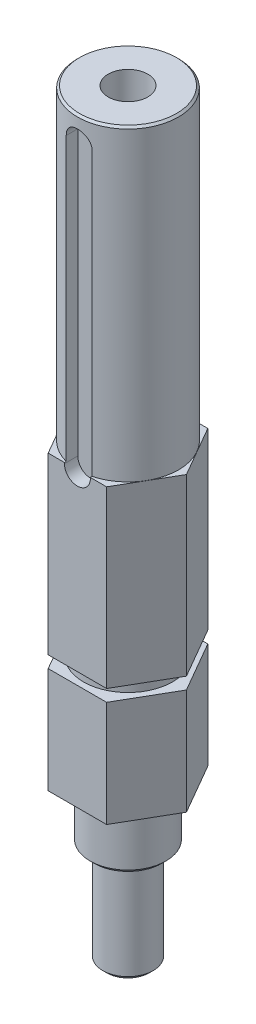
ISO-10303-21;
HEADER;
FILE_DESCRIPTION(('STEP AP214'),'2;1');
FILE_NAME('part.step','',(''),(''),'','','');
FILE_SCHEMA(('AUTOMOTIVE_DESIGN { 1 0 10303 214 1 1 1 1 }'));
ENDSEC;
DATA;
#1=APPLICATION_CONTEXT('core data for automotive mechanical design processes');
#2=APPLICATION_PROTOCOL_DEFINITION('international standard','automotive_design',2000,#1);
#3=PRODUCT_CONTEXT('',#1,'mechanical');
#4=PRODUCT('Part','Part','',(#3));
#5=PRODUCT_RELATED_PRODUCT_CATEGORY('part','',(#4));
#6=PRODUCT_DEFINITION_FORMATION('','',#4);
#7=PRODUCT_DEFINITION_CONTEXT('part definition',#1,'design');
#8=PRODUCT_DEFINITION('design','',#6,#7);
#9=PRODUCT_DEFINITION_SHAPE('','',#8);
#10=(LENGTH_UNIT() NAMED_UNIT(*) SI_UNIT(.MILLI.,.METRE.));
#11=(NAMED_UNIT(*) PLANE_ANGLE_UNIT() SI_UNIT($,.RADIAN.));
#12=(NAMED_UNIT(*) SI_UNIT($,.STERADIAN.) SOLID_ANGLE_UNIT());
#13=UNCERTAINTY_MEASURE_WITH_UNIT(LENGTH_MEASURE(1.E-05),#10,'distance_accuracy_value','');
#14=(GEOMETRIC_REPRESENTATION_CONTEXT(3) GLOBAL_UNCERTAINTY_ASSIGNED_CONTEXT((#13)) GLOBAL_UNIT_ASSIGNED_CONTEXT((#10,
#11,#12)) REPRESENTATION_CONTEXT('',''));
#15=CARTESIAN_POINT('',(0.,0.,0.));
#16=DIRECTION('',(0.,0.,1.));
#17=DIRECTION('',(1.,0.,0.));
#18=AXIS2_PLACEMENT_3D('',#15,#16,#17);
#19=CARTESIAN_POINT('',(-38.3071337161431,-56.515,-16.669011646302));
#20=DIRECTION('',(0.,1.,0.));
#21=DIRECTION('',(0.,0.,1.));
#22=AXIS2_PLACEMENT_3D('',#19,#20,#21);
#23=PLANE('',#22);
#24=CARTESIAN_POINT('',(-38.3071337161431,-56.515000000104,-16.669011646302));
#25=DIRECTION('',(0.,1.,0.));
#26=DIRECTION('',(0.,0.,1.));
#27=AXIS2_PLACEMENT_3D('',#24,#25,#26);
#28=CIRCLE('',#27,2.6542999999766);
#29=CARTESIAN_POINT('',(-38.3071337161431,-56.515000000104,-14.0147116463254));
#30=VERTEX_POINT('',#29);
#31=EDGE_CURVE('E20',#30,#30,#28,.T.);
#32=ORIENTED_EDGE('',*,*,#31,.F.);
#33=EDGE_LOOP('',(#32));
#34=FACE_BOUND('',#33,.T.);
#35=ADVANCED_FACE('F17',(#34),#23,.F.);
#36=CARTESIAN_POINT('',(-38.3071337161431,-56.007000000136,-16.669011646302));
#37=DIRECTION('',(0.,1.,0.));
#38=DIRECTION('',(0.,0.,1.));
#39=AXIS2_PLACEMENT_3D('',#36,#37,#38);
#40=CONICAL_SURFACE('',#39,3.16229999994458,0.785398163397448);
#41=CARTESIAN_POINT('',(-38.3071337161431,-56.007,-16.669011646302));
#42=DIRECTION('',(0.,1.,0.));
#43=DIRECTION('',(0.,0.,1.));
#44=AXIS2_PLACEMENT_3D('',#41,#42,#43);
#45=CIRCLE('',#44,3.1623);
#46=CARTESIAN_POINT('',(-38.3071337161431,-56.007,-13.506711646302));
#47=VERTEX_POINT('',#46);
#48=EDGE_CURVE('E224',#47,#47,#45,.T.);
#49=ORIENTED_EDGE('',*,*,#48,.F.);
#50=EDGE_LOOP('',(#49));
#51=FACE_BOUND('',#50,.T.);
#52=ORIENTED_EDGE('',*,*,#31,.T.);
#53=EDGE_LOOP('',(#52));
#54=FACE_BOUND('',#53,.T.);
#55=ADVANCED_FACE('F298',(#51,#54),#40,.T.);
#56=CARTESIAN_POINT('',(-38.3071337161431,-56.515,-16.669011646302));
#57=DIRECTION('',(0.,1.,0.));
#58=DIRECTION('',(0.,0.,1.));
#59=AXIS2_PLACEMENT_3D('',#56,#57,#58);
#60=CYLINDRICAL_SURFACE('',#59,3.1623);
#61=CARTESIAN_POINT('',(-38.3071337161431,-43.815,-16.669011646302));
#62=DIRECTION('',(0.,1.,0.));
#63=DIRECTION('',(0.,0.,1.));
#64=AXIS2_PLACEMENT_3D('',#61,#62,#63);
#65=CIRCLE('',#64,3.1623);
#66=CARTESIAN_POINT('',(-38.3071337161431,-43.815,-13.506711646302));
#67=VERTEX_POINT('',#66);
#68=EDGE_CURVE('E226',#67,#67,#65,.F.);
#69=ORIENTED_EDGE('',*,*,#68,.T.);
#70=EDGE_LOOP('',(#69));
#71=FACE_BOUND('',#70,.T.);
#72=ORIENTED_EDGE('',*,*,#48,.T.);
#73=EDGE_LOOP('',(#72));
#74=FACE_BOUND('',#73,.T.);
#75=ADVANCED_FACE('F283',(#71,#74),#60,.T.);
#76=CARTESIAN_POINT('',(-38.3071337161431,-43.815,-16.669011646302));
#77=DIRECTION('',(0.,1.,0.));
#78=DIRECTION('',(0.,0.,1.));
#79=AXIS2_PLACEMENT_3D('',#76,#77,#78);
#80=PLANE('',#79);
#81=CARTESIAN_POINT('',(-38.3071337161431,-43.8150000000519,-16.669011646302));
#82=DIRECTION('',(0.,1.,0.));
#83=DIRECTION('',(0.,0.,1.));
#84=AXIS2_PLACEMENT_3D('',#81,#82,#83);
#85=CIRCLE('',#84,4.24179999994759);
#86=CARTESIAN_POINT('',(-38.3071337161431,-43.8150000000519,-12.4272116463544));
#87=VERTEX_POINT('',#86);
#88=EDGE_CURVE('E223',#87,#87,#85,.T.);
#89=ORIENTED_EDGE('',*,*,#88,.F.);
#90=EDGE_LOOP('',(#89));
#91=FACE_BOUND('',#90,.T.);
#92=ORIENTED_EDGE('',*,*,#68,.F.);
#93=EDGE_LOOP('',(#92));
#94=FACE_BOUND('',#93,.T.);
#95=ADVANCED_FACE('F286',(#91,#94),#80,.F.);
#96=CARTESIAN_POINT('',(-38.3071337161431,-43.3069999999134,-16.669011646302));
#97=DIRECTION('',(0.,1.,0.));
#98=DIRECTION('',(0.,0.,1.));
#99=AXIS2_PLACEMENT_3D('',#96,#97,#98);
#100=CONICAL_SURFACE('',#99,4.7498000000861,0.785398163397448);
#101=CARTESIAN_POINT('',(-38.3071337161431,-43.307,-16.669011646302));
#102=DIRECTION('',(0.,1.,0.));
#103=DIRECTION('',(0.,0.,1.));
#104=AXIS2_PLACEMENT_3D('',#101,#102,#103);
#105=CIRCLE('',#104,4.7498);
#106=CARTESIAN_POINT('',(-38.3071337161431,-43.307,-11.919211646302));
#107=VERTEX_POINT('',#106);
#108=EDGE_CURVE('E220',#107,#107,#105,.T.);
#109=ORIENTED_EDGE('',*,*,#108,.F.);
#110=EDGE_LOOP('',(#109));
#111=FACE_BOUND('',#110,.T.);
#112=ORIENTED_EDGE('',*,*,#88,.T.);
#113=EDGE_LOOP('',(#112));
#114=FACE_BOUND('',#113,.T.);
#115=ADVANCED_FACE('F288',(#111,#114),#100,.T.);
#116=CARTESIAN_POINT('',(-38.3071337161431,-43.815,-16.669011646302));
#117=DIRECTION('',(0.,1.,0.));
#118=DIRECTION('',(0.,0.,1.));
#119=AXIS2_PLACEMENT_3D('',#116,#117,#118);
#120=CYLINDRICAL_SURFACE('',#119,4.7498);
#121=CARTESIAN_POINT('',(-38.3071337161431,-36.703,-16.669011646302));
#122=DIRECTION('',(0.,1.,0.));
#123=DIRECTION('',(0.,0.,1.));
#124=AXIS2_PLACEMENT_3D('',#121,#122,#123);
#125=CIRCLE('',#124,4.7498);
#126=CARTESIAN_POINT('',(-38.3071337161431,-36.703,-11.919211646302));
#127=VERTEX_POINT('',#126);
#128=EDGE_CURVE('E219',#127,#127,#125,.F.);
#129=ORIENTED_EDGE('',*,*,#128,.T.);
#130=EDGE_LOOP('',(#129));
#131=FACE_BOUND('',#130,.T.);
#132=ORIENTED_EDGE('',*,*,#108,.T.);
#133=EDGE_LOOP('',(#132));
#134=FACE_BOUND('',#133,.T.);
#135=ADVANCED_FACE('F295',(#131,#134),#120,.T.);
#136=CARTESIAN_POINT('',(-38.3071337161431,-36.703,-3.96901164630201));
#137=DIRECTION('',(0.,1.,0.));
#138=DIRECTION('',(0.,0.,1.));
#139=AXIS2_PLACEMENT_3D('',#136,#137,#138);
#140=PLANE('',#139);
#141=DIRECTION('',(-0.5,0.,0.866025403784438));
#142=VECTOR('',#141,1.);
#143=CARTESIAN_POINT('',(-41.9733079254973,-36.703,-23.019011646302));
#144=LINE('',#143,#142);
#145=CARTESIAN_POINT('',(-41.9733079254973,-36.703,-23.019011646302));
#146=VERTEX_POINT('',#145);
#147=CARTESIAN_POINT('',(-45.6394821348514,-36.703,-16.669011646302));
#148=VERTEX_POINT('',#147);
#149=EDGE_CURVE('E216',#146,#148,#144,.T.);
#150=ORIENTED_EDGE('',*,*,#149,.F.);
#151=DIRECTION('',(-1.,0.,0.));
#152=VECTOR('',#151,1.);
#153=CARTESIAN_POINT('',(-34.640959506789,-36.703,-23.019011646302));
#154=LINE('',#153,#152);
#155=CARTESIAN_POINT('',(-34.640959506789,-36.703,-23.019011646302));
#156=VERTEX_POINT('',#155);
#157=EDGE_CURVE('E213',#156,#146,#154,.T.);
#158=ORIENTED_EDGE('',*,*,#157,.F.);
#159=DIRECTION('',(-0.5,0.,-0.866025403784438));
#160=VECTOR('',#159,1.);
#161=CARTESIAN_POINT('',(-30.9747852974349,-36.703,-16.669011646302));
#162=LINE('',#161,#160);
#163=CARTESIAN_POINT('',(-30.9747852974349,-36.703,-16.669011646302));
#164=VERTEX_POINT('',#163);
#165=EDGE_CURVE('E207',#164,#156,#162,.T.);
#166=ORIENTED_EDGE('',*,*,#165,.F.);
#167=DIRECTION('',(0.500000000000001,0.,-0.866025403784438));
#168=VECTOR('',#167,1.);
#169=CARTESIAN_POINT('',(-34.640959506789,-36.703,-10.319011646302));
#170=LINE('',#169,#168);
#171=CARTESIAN_POINT('',(-34.640959506789,-36.703,-10.319011646302));
#172=VERTEX_POINT('',#171);
#173=EDGE_CURVE('E201',#172,#164,#170,.T.);
#174=ORIENTED_EDGE('',*,*,#173,.F.);
#175=DIRECTION('',(1.,0.,0.));
#176=VECTOR('',#175,1.);
#177=CARTESIAN_POINT('',(-41.9733079254973,-36.703,-10.319011646302));
#178=LINE('',#177,#176);
#179=CARTESIAN_POINT('',(-41.9733079254973,-36.703,-10.319011646302));
#180=VERTEX_POINT('',#179);
#181=EDGE_CURVE('E195',#180,#172,#178,.T.);
#182=ORIENTED_EDGE('',*,*,#181,.F.);
#183=DIRECTION('',(0.5,0.,0.866025403784438));
#184=VECTOR('',#183,1.);
#185=CARTESIAN_POINT('',(-45.6394821348514,-36.703,-16.669011646302));
#186=LINE('',#185,#184);
#187=EDGE_CURVE('E186',#148,#180,#186,.T.);
#188=ORIENTED_EDGE('',*,*,#187,.F.);
#189=EDGE_LOOP('',(#150,#158,#166,#174,#182,#188));
#190=FACE_BOUND('',#189,.T.);
#191=ORIENTED_EDGE('',*,*,#128,.F.);
#192=EDGE_LOOP('',(#191));
#193=FACE_BOUND('',#192,.T.);
#194=ADVANCED_FACE('F348',(#190,#193),#140,.F.);
#195=CARTESIAN_POINT('',(-41.9733079254973,-36.703,-23.019011646302));
#196=DIRECTION('',(-0.866025403784438,0.,-0.5));
#197=DIRECTION('',(-0.5,0.,0.866025403784438));
#198=AXIS2_PLACEMENT_3D('',#195,#196,#197);
#199=PLANE('',#198);
#200=ORIENTED_EDGE('',*,*,#149,.T.);
#201=DIRECTION('',(0.,1.,0.));
#202=VECTOR('',#201,1.);
#203=CARTESIAN_POINT('',(-45.6394821348514,-36.703,-16.669011646302));
#204=LINE('',#203,#202);
#205=CARTESIAN_POINT('',(-45.6394821348514,-23.4188,-16.669011646302));
#206=VERTEX_POINT('',#205);
#207=EDGE_CURVE('E189',#206,#148,#204,.F.);
#208=ORIENTED_EDGE('',*,*,#207,.F.);
#209=DIRECTION('',(0.5,0.,-0.866025403784438));
#210=VECTOR('',#209,1.);
#211=CARTESIAN_POINT('',(-45.6394821348514,-23.4188,-16.669011646302));
#212=LINE('',#211,#210);
#213=CARTESIAN_POINT('',(-41.9733079254973,-23.4188,-23.019011646302));
#214=VERTEX_POINT('',#213);
#215=EDGE_CURVE('E180',#206,#214,#212,.T.);
#216=ORIENTED_EDGE('',*,*,#215,.T.);
#217=DIRECTION('',(0.,1.,0.));
#218=VECTOR('',#217,1.);
#219=CARTESIAN_POINT('',(-41.9733079254973,-36.703,-23.019011646302));
#220=LINE('',#219,#218);
#221=EDGE_CURVE('E210',#146,#214,#220,.T.);
#222=ORIENTED_EDGE('',*,*,#221,.F.);
#223=EDGE_LOOP('',(#200,#208,#216,#222));
#224=FACE_BOUND('',#223,.T.);
#225=ADVANCED_FACE('F357',(#224),#199,.T.);
#226=CARTESIAN_POINT('',(-34.640959506789,-36.703,-23.019011646302));
#227=DIRECTION('',(0.,0.,-1.));
#228=DIRECTION('',(-1.,0.,0.));
#229=AXIS2_PLACEMENT_3D('',#226,#227,#228);
#230=PLANE('',#229);
#231=ORIENTED_EDGE('',*,*,#157,.T.);
#232=ORIENTED_EDGE('',*,*,#221,.T.);
#233=DIRECTION('',(1.,0.,0.));
#234=VECTOR('',#233,1.);
#235=CARTESIAN_POINT('',(-21.7881364409388,-23.4188,-23.019011646302));
#236=LINE('',#235,#234);
#237=CARTESIAN_POINT('',(-34.640959506789,-23.4188,-23.019011646302));
#238=VERTEX_POINT('',#237);
#239=EDGE_CURVE('E177',#214,#238,#236,.T.);
#240=ORIENTED_EDGE('',*,*,#239,.T.);
#241=DIRECTION('',(0.,1.,0.));
#242=VECTOR('',#241,1.);
#243=CARTESIAN_POINT('',(-34.640959506789,-36.703,-23.019011646302));
#244=LINE('',#243,#242);
#245=EDGE_CURVE('E204',#156,#238,#244,.T.);
#246=ORIENTED_EDGE('',*,*,#245,.F.);
#247=EDGE_LOOP('',(#231,#232,#240,#246));
#248=FACE_BOUND('',#247,.T.);
#249=ADVANCED_FACE('F367',(#248),#230,.T.);
#250=CARTESIAN_POINT('',(-30.9747852974349,-36.703,-16.669011646302));
#251=DIRECTION('',(0.866025403784438,0.,-0.5));
#252=DIRECTION('',(-0.5,0.,-0.866025403784438));
#253=AXIS2_PLACEMENT_3D('',#250,#251,#252);
#254=PLANE('',#253);
#255=ORIENTED_EDGE('',*,*,#165,.T.);
#256=ORIENTED_EDGE('',*,*,#245,.T.);
#257=DIRECTION('',(0.5,0.,0.866025403784438));
#258=VECTOR('',#257,1.);
#259=CARTESIAN_POINT('',(-34.640959506789,-23.4188,-23.019011646302));
#260=LINE('',#259,#258);
#261=CARTESIAN_POINT('',(-30.9747852974349,-23.4188,-16.669011646302));
#262=VERTEX_POINT('',#261);
#263=EDGE_CURVE('E174',#238,#262,#260,.T.);
#264=ORIENTED_EDGE('',*,*,#263,.T.);
#265=DIRECTION('',(0.,1.,0.));
#266=VECTOR('',#265,1.);
#267=CARTESIAN_POINT('',(-30.9747852974349,-36.703,-16.669011646302));
#268=LINE('',#267,#266);
#269=EDGE_CURVE('E198',#164,#262,#268,.T.);
#270=ORIENTED_EDGE('',*,*,#269,.F.);
#271=EDGE_LOOP('',(#255,#256,#264,#270));
#272=FACE_BOUND('',#271,.T.);
#273=ADVANCED_FACE('F377',(#272),#254,.T.);
#274=CARTESIAN_POINT('',(-34.640959506789,-36.703,-10.319011646302));
#275=DIRECTION('',(0.866025403784438,0.,0.500000000000001));
#276=DIRECTION('',(0.500000000000001,0.,-0.866025403784438));
#277=AXIS2_PLACEMENT_3D('',#274,#275,#276);
#278=PLANE('',#277);
#279=ORIENTED_EDGE('',*,*,#173,.T.);
#280=ORIENTED_EDGE('',*,*,#269,.T.);
#281=DIRECTION('',(-0.500000000000001,0.,0.866025403784438));
#282=VECTOR('',#281,1.);
#283=CARTESIAN_POINT('',(-30.9747852974349,-23.4188,-16.669011646302));
#284=LINE('',#283,#282);
#285=CARTESIAN_POINT('',(-34.640959506789,-23.4188,-10.319011646302));
#286=VERTEX_POINT('',#285);
#287=EDGE_CURVE('E171',#262,#286,#284,.T.);
#288=ORIENTED_EDGE('',*,*,#287,.T.);
#289=DIRECTION('',(0.,1.,0.));
#290=VECTOR('',#289,1.);
#291=CARTESIAN_POINT('',(-34.640959506789,-36.703,-10.319011646302));
#292=LINE('',#291,#290);
#293=EDGE_CURVE('E192',#172,#286,#292,.T.);
#294=ORIENTED_EDGE('',*,*,#293,.F.);
#295=EDGE_LOOP('',(#279,#280,#288,#294));
#296=FACE_BOUND('',#295,.T.);
#297=ADVANCED_FACE('F387',(#296),#278,.T.);
#298=CARTESIAN_POINT('',(-41.9733079254973,-36.703,-10.319011646302));
#299=DIRECTION('',(0.,0.,1.));
#300=DIRECTION('',(1.,0.,0.));
#301=AXIS2_PLACEMENT_3D('',#298,#299,#300);
#302=PLANE('',#301);
#303=ORIENTED_EDGE('',*,*,#181,.T.);
#304=ORIENTED_EDGE('',*,*,#293,.T.);
#305=DIRECTION('',(1.,0.,0.));
#306=VECTOR('',#305,1.);
#307=CARTESIAN_POINT('',(-21.7881364409388,-23.4188,-10.319011646302));
#308=LINE('',#307,#306);
#309=CARTESIAN_POINT('',(-41.9733079254973,-23.4188,-10.319011646302));
#310=VERTEX_POINT('',#309);
#311=EDGE_CURVE('E168',#286,#310,#308,.F.);
#312=ORIENTED_EDGE('',*,*,#311,.T.);
#313=DIRECTION('',(0.,1.,0.));
#314=VECTOR('',#313,1.);
#315=CARTESIAN_POINT('',(-41.9733079254973,-36.703,-10.319011646302));
#316=LINE('',#315,#314);
#317=EDGE_CURVE('E183',#180,#310,#316,.T.);
#318=ORIENTED_EDGE('',*,*,#317,.F.);
#319=EDGE_LOOP('',(#303,#304,#312,#318));
#320=FACE_BOUND('',#319,.T.);
#321=ADVANCED_FACE('F397',(#320),#302,.T.);
#322=CARTESIAN_POINT('',(-45.6394821348514,-36.703,-16.669011646302));
#323=DIRECTION('',(-0.866025403784438,0.,0.5));
#324=DIRECTION('',(0.5,0.,0.866025403784438));
#325=AXIS2_PLACEMENT_3D('',#322,#323,#324);
#326=PLANE('',#325);
#327=ORIENTED_EDGE('',*,*,#187,.T.);
#328=ORIENTED_EDGE('',*,*,#317,.T.);
#329=DIRECTION('',(-0.5,0.,-0.866025403784438));
#330=VECTOR('',#329,1.);
#331=CARTESIAN_POINT('',(-41.9733079254973,-23.4188,-10.319011646302));
#332=LINE('',#331,#330);
#333=EDGE_CURVE('E165',#310,#206,#332,.T.);
#334=ORIENTED_EDGE('',*,*,#333,.T.);
#335=ORIENTED_EDGE('',*,*,#207,.T.);
#336=EDGE_LOOP('',(#327,#328,#334,#335));
#337=FACE_BOUND('',#336,.T.);
#338=ADVANCED_FACE('F407',(#337),#326,.T.);
#339=CARTESIAN_POINT('',(-21.7881364409388,-23.4188,-16.669011646302));
#340=DIRECTION('',(0.,-1.,0.));
#341=DIRECTION('',(0.,0.,-1.));
#342=AXIS2_PLACEMENT_3D('',#339,#340,#341);
#343=PLANE('',#342);
#344=ORIENTED_EDGE('',*,*,#311,.F.);
#345=ORIENTED_EDGE('',*,*,#287,.F.);
#346=ORIENTED_EDGE('',*,*,#263,.F.);
#347=ORIENTED_EDGE('',*,*,#239,.F.);
#348=ORIENTED_EDGE('',*,*,#215,.F.);
#349=ORIENTED_EDGE('',*,*,#333,.F.);
#350=EDGE_LOOP('',(#344,#345,#346,#347,#348,#349));
#351=FACE_BOUND('',#350,.T.);
#352=CARTESIAN_POINT('',(-38.3071337161431,-23.4188,-16.669011646302));
#353=DIRECTION('',(0.,1.,0.));
#354=DIRECTION('',(0.,0.,1.));
#355=AXIS2_PLACEMENT_3D('',#352,#353,#354);
#356=CIRCLE('',#355,5.58800000000003);
#357=CARTESIAN_POINT('',(-38.3071337161431,-23.4188,-11.081011646302));
#358=VERTEX_POINT('',#357);
#359=EDGE_CURVE('E164',#358,#358,#356,.T.);
#360=ORIENTED_EDGE('',*,*,#359,.F.);
#361=EDGE_LOOP('',(#360));
#362=FACE_BOUND('',#361,.T.);
#363=ADVANCED_FACE('F417',(#351,#362),#343,.F.);
#364=CARTESIAN_POINT('',(-38.3071337161431,22.7329999999029,-16.669011646302));
#365=DIRECTION('',(0.,1.,0.));
#366=DIRECTION('',(0.,0.,1.));
#367=AXIS2_PLACEMENT_3D('',#364,#365,#366);
#368=CONICAL_SURFACE('',#367,2.48792999978594,1.02974425852415);
#369=CARTESIAN_POINT('',(-38.3071337161431,21.2381008400087,-16.6690116465702));
#370=VERTEX_POINT('',#369);
#371=VERTEX_LOOP('',#370);
#372=FACE_BOUND('',#371,.T.);
#373=CARTESIAN_POINT('',(-38.3071337161431,22.733,-16.669011646302));
#374=DIRECTION('',(0.,-1.,0.));
#375=DIRECTION('',(0.,0.,-1.));
#376=AXIS2_PLACEMENT_3D('',#373,#374,#375);
#377=CIRCLE('',#376,2.48793);
#378=CARTESIAN_POINT('',(-38.3071337161431,22.733,-19.156941646302));
#379=VERTEX_POINT('',#378);
#380=EDGE_CURVE('E161',#379,#379,#377,.F.);
#381=ORIENTED_EDGE('',*,*,#380,.T.);
#382=EDGE_LOOP('',(#381));
#383=FACE_BOUND('',#382,.T.);
#384=ADVANCED_FACE('F427',(#372,#383),#368,.F.);
#385=CARTESIAN_POINT('',(-38.3071337161431,-25.4,-16.669011646302));
#386=DIRECTION('',(0.,1.,0.));
#387=DIRECTION('',(0.,0.,1.));
#388=AXIS2_PLACEMENT_3D('',#385,#386,#387);
#389=CYLINDRICAL_SURFACE('',#388,5.58800000000003);
#390=CARTESIAN_POINT('',(-38.3071337161431,-21.9202,-16.669011646302));
#391=DIRECTION('',(0.,1.,0.));
#392=DIRECTION('',(0.,0.,1.));
#393=AXIS2_PLACEMENT_3D('',#390,#391,#392);
#394=CIRCLE('',#393,5.58800000000003);
#395=CARTESIAN_POINT('',(-38.3071337161431,-21.9202,-11.081011646302));
#396=VERTEX_POINT('',#395);
#397=EDGE_CURVE('E76',#396,#396,#394,.F.);
#398=ORIENTED_EDGE('',*,*,#397,.T.);
#399=EDGE_LOOP('',(#398));
#400=FACE_BOUND('',#399,.T.);
#401=ORIENTED_EDGE('',*,*,#359,.T.);
#402=EDGE_LOOP('',(#401));
#403=FACE_BOUND('',#402,.T.);
#404=ADVANCED_FACE('F437',(#400,#403),#389,.T.);
#405=CARTESIAN_POINT('',(-38.3071337161431,38.608,-16.669011646302));
#406=DIRECTION('',(0.,-1.,0.));
#407=DIRECTION('',(0.,0.,-1.));
#408=AXIS2_PLACEMENT_3D('',#405,#406,#407);
#409=CYLINDRICAL_SURFACE('',#408,2.48793);
#410=CARTESIAN_POINT('',(-38.3071337161431,38.608,-16.669011646302));
#411=DIRECTION('',(0.,-1.,0.));
#412=DIRECTION('',(0.,0.,-1.));
#413=AXIS2_PLACEMENT_3D('',#410,#411,#412);
#414=CIRCLE('',#413,2.48793);
#415=CARTESIAN_POINT('',(-38.3071337161431,38.608,-19.156941646302));
#416=VERTEX_POINT('',#415);
#417=EDGE_CURVE('E86',#416,#416,#414,.F.);
#418=ORIENTED_EDGE('',*,*,#417,.T.);
#419=EDGE_LOOP('',(#418));
#420=FACE_BOUND('',#419,.T.);
#421=ORIENTED_EDGE('',*,*,#380,.F.);
#422=EDGE_LOOP('',(#421));
#423=FACE_BOUND('',#422,.T.);
#424=ADVANCED_FACE('F447',(#420,#423),#409,.F.);
#425=CARTESIAN_POINT('',(-38.3071337161431,-0.126999999999992,-11.995411646302));
#426=DIRECTION('',(0.,0.,1.));
#427=DIRECTION('',(1.,0.,0.));
#428=AXIS2_PLACEMENT_3D('',#425,#426,#427);
#429=CYLINDRICAL_SURFACE('',#428,1.6256);
#430=DIRECTION('',(0.,0.,1.));
#431=VECTOR('',#430,1.);
#432=CARTESIAN_POINT('',(-36.6815337161432,-0.126999999999992,-11.995411646302));
#433=LINE('',#432,#431);
#434=CARTESIAN_POINT('',(-36.6815337161432,-0.126999999999992,-11.995411646302));
#435=VERTEX_POINT('',#434);
#436=CARTESIAN_POINT('',(-36.6815337161432,-0.126999999999992,-10.319011646302));
#437=VERTEX_POINT('',#436);
#438=EDGE_CURVE('E67',#435,#437,#433,.T.);
#439=ORIENTED_EDGE('',*,*,#438,.F.);
#440=CARTESIAN_POINT('',(-38.3071337161431,-0.126999999999992,-11.995411646302));
#441=DIRECTION('',(0.,0.,1.));
#442=DIRECTION('',(1.,0.,0.));
#443=AXIS2_PLACEMENT_3D('',#440,#441,#442);
#444=CIRCLE('',#443,1.6256);
#445=CARTESIAN_POINT('',(-39.9327337161431,-0.126999999999992,-11.995411646302));
#446=VERTEX_POINT('',#445);
#447=EDGE_CURVE('E70',#435,#446,#444,.F.);
#448=ORIENTED_EDGE('',*,*,#447,.T.);
#449=DIRECTION('',(0.,0.,1.));
#450=VECTOR('',#449,1.);
#451=CARTESIAN_POINT('',(-39.9327337161431,-0.126999999999992,-11.995411646302));
#452=LINE('',#451,#450);
#453=CARTESIAN_POINT('',(-39.9327337161431,-0.126999999999992,-10.319011646302));
#454=VERTEX_POINT('',#453);
#455=EDGE_CURVE('E77',#454,#446,#452,.F.);
#456=ORIENTED_EDGE('',*,*,#455,.F.);
#457=CARTESIAN_POINT('',(-38.3071337161431,-0.126999999999992,-10.319011646302));
#458=DIRECTION('',(0.,0.,1.));
#459=DIRECTION('',(1.,0.,0.));
#460=AXIS2_PLACEMENT_3D('',#457,#458,#459);
#461=CIRCLE('',#460,1.6256);
#462=EDGE_CURVE('E73',#437,#454,#461,.F.);
#463=ORIENTED_EDGE('',*,*,#462,.F.);
#464=EDGE_LOOP('',(#439,#448,#456,#463));
#465=FACE_BOUND('',#464,.T.);
#466=ADVANCED_FACE('F69',(#465),#429,.F.);
#467=CARTESIAN_POINT('',(-32.7191337161431,-21.9202,-16.669011646302));
#468=DIRECTION('',(0.,1.,0.));
#469=DIRECTION('',(0.,0.,1.));
#470=AXIS2_PLACEMENT_3D('',#467,#468,#469);
#471=PLANE('',#470);
#472=ORIENTED_EDGE('',*,*,#397,.F.);
#473=EDGE_LOOP('',(#472));
#474=FACE_BOUND('',#473,.T.);
#475=DIRECTION('',(0.500000000000001,0.,-0.866025403784438));
#476=VECTOR('',#475,1.);
#477=CARTESIAN_POINT('',(-34.640959506789,-21.9202,-10.319011646302));
#478=LINE('',#477,#476);
#479=CARTESIAN_POINT('',(-34.640959506789,-21.9202,-10.319011646302));
#480=VERTEX_POINT('',#479);
#481=CARTESIAN_POINT('',(-30.9747852974349,-21.9202,-16.669011646302));
#482=VERTEX_POINT('',#481);
#483=EDGE_CURVE('E106',#480,#482,#478,.T.);
#484=ORIENTED_EDGE('',*,*,#483,.F.);
#485=DIRECTION('',(1.,0.,0.));
#486=VECTOR('',#485,1.);
#487=CARTESIAN_POINT('',(-41.9733079254973,-21.9202,-10.319011646302));
#488=LINE('',#487,#486);
#489=CARTESIAN_POINT('',(-41.9733079254973,-21.9202,-10.319011646302));
#490=VERTEX_POINT('',#489);
#491=EDGE_CURVE('E103',#490,#480,#488,.T.);
#492=ORIENTED_EDGE('',*,*,#491,.F.);
#493=DIRECTION('',(0.5,0.,0.866025403784438));
#494=VECTOR('',#493,1.);
#495=CARTESIAN_POINT('',(-45.6394821348514,-21.9202,-16.669011646302));
#496=LINE('',#495,#494);
#497=CARTESIAN_POINT('',(-45.6394821348514,-21.9202,-16.669011646302));
#498=VERTEX_POINT('',#497);
#499=EDGE_CURVE('E109',#498,#490,#496,.T.);
#500=ORIENTED_EDGE('',*,*,#499,.F.);
#501=DIRECTION('',(-0.5,0.,0.866025403784438));
#502=VECTOR('',#501,1.);
#503=CARTESIAN_POINT('',(-41.9733079254973,-21.9202,-23.019011646302));
#504=LINE('',#503,#502);
#505=CARTESIAN_POINT('',(-41.9733079254973,-21.9202,-23.019011646302));
#506=VERTEX_POINT('',#505);
#507=EDGE_CURVE('E116',#506,#498,#504,.T.);
#508=ORIENTED_EDGE('',*,*,#507,.F.);
#509=DIRECTION('',(-1.,0.,0.));
#510=VECTOR('',#509,1.);
#511=CARTESIAN_POINT('',(-34.640959506789,-21.9202,-23.019011646302));
#512=LINE('',#511,#510);
#513=CARTESIAN_POINT('',(-34.640959506789,-21.9202,-23.019011646302));
#514=VERTEX_POINT('',#513);
#515=EDGE_CURVE('E127',#514,#506,#512,.T.);
#516=ORIENTED_EDGE('',*,*,#515,.F.);
#517=DIRECTION('',(-0.5,0.,-0.866025403784438));
#518=VECTOR('',#517,1.);
#519=CARTESIAN_POINT('',(-30.9747852974349,-21.9202,-16.669011646302));
#520=LINE('',#519,#518);
#521=EDGE_CURVE('E137',#482,#514,#520,.T.);
#522=ORIENTED_EDGE('',*,*,#521,.F.);
#523=EDGE_LOOP('',(#484,#492,#500,#508,#516,#522));
#524=FACE_BOUND('',#523,.T.);
#525=ADVANCED_FACE('F466',(#474,#524),#471,.F.);
#526=CARTESIAN_POINT('',(-38.3071337161431,38.608,-16.669011646302));
#527=DIRECTION('',(0.,-1.,0.));
#528=DIRECTION('',(0.,0.,-1.));
#529=AXIS2_PLACEMENT_3D('',#526,#527,#528);
#530=PLANE('',#529);
#531=ORIENTED_EDGE('',*,*,#417,.F.);
#532=EDGE_LOOP('',(#531));
#533=FACE_BOUND('',#532,.T.);
#534=CARTESIAN_POINT('',(-38.3071337161431,38.6080000000106,-16.669011646302));
#535=DIRECTION('',(0.,-1.,0.));
#536=DIRECTION('',(0.,0.,-1.));
#537=AXIS2_PLACEMENT_3D('',#534,#535,#536);
#538=CIRCLE('',#537,6.08330000004106);
#539=CARTESIAN_POINT('',(-38.3071337161431,38.6080000000106,-22.7523116463431));
#540=VERTEX_POINT('',#539);
#541=EDGE_CURVE('E101',#540,#540,#538,.T.);
#542=ORIENTED_EDGE('',*,*,#541,.F.);
#543=EDGE_LOOP('',(#542));
#544=FACE_BOUND('',#543,.T.);
#545=ADVANCED_FACE('F475',(#533,#544),#530,.F.);
#546=CARTESIAN_POINT('',(-38.3071337161431,-0.126999999999992,-11.995411646302));
#547=DIRECTION('',(0.,0.,-1.));
#548=DIRECTION('',(-1.,0.,0.));
#549=AXIS2_PLACEMENT_3D('',#546,#547,#548);
#550=PLANE('',#549);
#551=DIRECTION('',(0.,-1.,0.));
#552=VECTOR('',#551,1.);
#553=CARTESIAN_POINT('',(-36.6815337161431,-0.126999999999992,-11.995411646302));
#554=LINE('',#553,#552);
#555=CARTESIAN_POINT('',(-36.6815337161432,35.433,-11.995411646302));
#556=VERTEX_POINT('',#555);
#557=EDGE_CURVE('E82',#556,#435,#554,.T.);
#558=ORIENTED_EDGE('',*,*,#557,.F.);
#559=CARTESIAN_POINT('',(-38.3071337161431,35.433,-11.995411646302));
#560=DIRECTION('',(0.,0.,1.));
#561=DIRECTION('',(1.,0.,0.));
#562=AXIS2_PLACEMENT_3D('',#559,#560,#561);
#563=CIRCLE('',#562,1.6256);
#564=CARTESIAN_POINT('',(-39.9327337161431,35.433,-11.995411646302));
#565=VERTEX_POINT('',#564);
#566=EDGE_CURVE('E237',#556,#565,#563,.T.);
#567=ORIENTED_EDGE('',*,*,#566,.T.);
#568=DIRECTION('',(0.,1.,0.));
#569=VECTOR('',#568,1.);
#570=CARTESIAN_POINT('',(-39.9327337161431,-0.126999999999992,-11.995411646302));
#571=LINE('',#570,#569);
#572=EDGE_CURVE('E85',#446,#565,#571,.T.);
#573=ORIENTED_EDGE('',*,*,#572,.F.);
#574=ORIENTED_EDGE('',*,*,#447,.F.);
#575=EDGE_LOOP('',(#558,#567,#573,#574));
#576=FACE_BOUND('',#575,.T.);
#577=ADVANCED_FACE('F81',(#576),#550,.F.);
#578=CARTESIAN_POINT('',(-41.9733079254973,-36.703,-10.319011646302));
#579=DIRECTION('',(0.,0.,1.));
#580=DIRECTION('',(1.,0.,0.));
#581=AXIS2_PLACEMENT_3D('',#578,#579,#580);
#582=PLANE('',#581);
#583=DIRECTION('',(1.,0.,0.));
#584=VECTOR('',#583,1.);
#585=CARTESIAN_POINT('',(-38.3071337161431,0.,-10.319011646302));
#586=LINE('',#585,#584);
#587=CARTESIAN_POINT('',(-36.6815337161431,0.,-10.319011646302));
#588=VERTEX_POINT('',#587);
#589=CARTESIAN_POINT('',(-34.640959506789,0.,-10.319011646302));
#590=VERTEX_POINT('',#589);
#591=EDGE_CURVE('E620',#588,#590,#586,.T.);
#592=ORIENTED_EDGE('',*,*,#591,.F.);
#593=DIRECTION('',(0.,-1.,0.));
#594=VECTOR('',#593,1.);
#595=CARTESIAN_POINT('',(-36.6815337161431,-0.126999999999992,-10.319011646302));
#596=LINE('',#595,#594);
#597=EDGE_CURVE('E90',#437,#588,#596,.F.);
#598=ORIENTED_EDGE('',*,*,#597,.F.);
#599=ORIENTED_EDGE('',*,*,#462,.T.);
#600=DIRECTION('',(0.,1.,0.));
#601=VECTOR('',#600,1.);
#602=CARTESIAN_POINT('',(-39.9327337161431,-0.126999999999992,-10.319011646302));
#603=LINE('',#602,#601);
#604=CARTESIAN_POINT('',(-39.9327337161431,0.,-10.319011646302));
#605=VERTEX_POINT('',#604);
#606=EDGE_CURVE('E102',#605,#454,#603,.F.);
#607=ORIENTED_EDGE('',*,*,#606,.F.);
#608=DIRECTION('',(1.,0.,0.));
#609=VECTOR('',#608,1.);
#610=CARTESIAN_POINT('',(-38.3071337161431,0.,-10.319011646302));
#611=LINE('',#610,#609);
#612=CARTESIAN_POINT('',(-41.9733079254973,0.,-10.319011646302));
#613=VERTEX_POINT('',#612);
#614=EDGE_CURVE('E92',#613,#605,#611,.T.);
#615=ORIENTED_EDGE('',*,*,#614,.F.);
#616=DIRECTION('',(0.,1.,0.));
#617=VECTOR('',#616,1.);
#618=CARTESIAN_POINT('',(-41.9733079254973,-36.703,-10.319011646302));
#619=LINE('',#618,#617);
#620=EDGE_CURVE('E112',#490,#613,#619,.T.);
#621=ORIENTED_EDGE('',*,*,#620,.F.);
#622=ORIENTED_EDGE('',*,*,#491,.T.);
#623=DIRECTION('',(0.,1.,0.));
#624=VECTOR('',#623,1.);
#625=CARTESIAN_POINT('',(-34.640959506789,-36.703,-10.319011646302));
#626=LINE('',#625,#624);
#627=EDGE_CURVE('E140',#590,#480,#626,.F.);
#628=ORIENTED_EDGE('',*,*,#627,.F.);
#629=EDGE_LOOP('',(#592,#598,#599,#607,#615,#621,#622,#628));
#630=FACE_BOUND('',#629,.T.);
#631=ADVANCED_FACE('F494',(#630),#582,.T.);
#632=CARTESIAN_POINT('',(-34.640959506789,-36.703,-10.319011646302));
#633=DIRECTION('',(0.866025403784438,0.,0.500000000000001));
#634=DIRECTION('',(0.500000000000001,0.,-0.866025403784438));
#635=AXIS2_PLACEMENT_3D('',#632,#633,#634);
#636=PLANE('',#635);
#637=DIRECTION('',(0.500000000000001,0.,-0.866025403784438));
#638=VECTOR('',#637,1.);
#639=CARTESIAN_POINT('',(-34.640959506789,0.,-10.319011646302));
#640=LINE('',#639,#638);
#641=CARTESIAN_POINT('',(-30.9747852974349,0.,-16.669011646302));
#642=VERTEX_POINT('',#641);
#643=EDGE_CURVE('E617',#590,#642,#640,.T.);
#644=ORIENTED_EDGE('',*,*,#643,.F.);
#645=ORIENTED_EDGE('',*,*,#627,.T.);
#646=ORIENTED_EDGE('',*,*,#483,.T.);
#647=DIRECTION('',(0.,1.,0.));
#648=VECTOR('',#647,1.);
#649=CARTESIAN_POINT('',(-30.9747852974349,-36.703,-16.669011646302));
#650=LINE('',#649,#648);
#651=EDGE_CURVE('E130',#642,#482,#650,.F.);
#652=ORIENTED_EDGE('',*,*,#651,.F.);
#653=EDGE_LOOP('',(#644,#645,#646,#652));
#654=FACE_BOUND('',#653,.T.);
#655=ADVANCED_FACE('F503',(#654),#636,.T.);
#656=CARTESIAN_POINT('',(-30.9747852974349,-36.703,-16.669011646302));
#657=DIRECTION('',(0.866025403784438,0.,-0.5));
#658=DIRECTION('',(-0.5,0.,-0.866025403784438));
#659=AXIS2_PLACEMENT_3D('',#656,#657,#658);
#660=PLANE('',#659);
#661=DIRECTION('',(-0.5,0.,-0.866025403784438));
#662=VECTOR('',#661,1.);
#663=CARTESIAN_POINT('',(-30.9747852974349,0.,-16.669011646302));
#664=LINE('',#663,#662);
#665=CARTESIAN_POINT('',(-34.640959506789,0.,-23.019011646302));
#666=VERTEX_POINT('',#665);
#667=EDGE_CURVE('E614',#642,#666,#664,.T.);
#668=ORIENTED_EDGE('',*,*,#667,.F.);
#669=ORIENTED_EDGE('',*,*,#651,.T.);
#670=ORIENTED_EDGE('',*,*,#521,.T.);
#671=DIRECTION('',(0.,1.,0.));
#672=VECTOR('',#671,1.);
#673=CARTESIAN_POINT('',(-34.640959506789,-36.703,-23.019011646302));
#674=LINE('',#673,#672);
#675=EDGE_CURVE('E119',#666,#514,#674,.F.);
#676=ORIENTED_EDGE('',*,*,#675,.F.);
#677=EDGE_LOOP('',(#668,#669,#670,#676));
#678=FACE_BOUND('',#677,.T.);
#679=ADVANCED_FACE('F513',(#678),#660,.T.);
#680=CARTESIAN_POINT('',(-34.640959506789,-36.703,-23.019011646302));
#681=DIRECTION('',(0.,0.,-1.));
#682=DIRECTION('',(-1.,0.,0.));
#683=AXIS2_PLACEMENT_3D('',#680,#681,#682);
#684=PLANE('',#683);
#685=DIRECTION('',(1.,0.,0.));
#686=VECTOR('',#685,1.);
#687=CARTESIAN_POINT('',(-38.3071337161431,0.,-23.019011646302));
#688=LINE('',#687,#686);
#689=CARTESIAN_POINT('',(-41.9733079254973,0.,-23.019011646302));
#690=VERTEX_POINT('',#689);
#691=EDGE_CURVE('E611',#666,#690,#688,.F.);
#692=ORIENTED_EDGE('',*,*,#691,.F.);
#693=ORIENTED_EDGE('',*,*,#675,.T.);
#694=ORIENTED_EDGE('',*,*,#515,.T.);
#695=DIRECTION('',(0.,1.,0.));
#696=VECTOR('',#695,1.);
#697=CARTESIAN_POINT('',(-41.9733079254973,-36.703,-23.019011646302));
#698=LINE('',#697,#696);
#699=EDGE_CURVE('E113',#690,#506,#698,.F.);
#700=ORIENTED_EDGE('',*,*,#699,.F.);
#701=EDGE_LOOP('',(#692,#693,#694,#700));
#702=FACE_BOUND('',#701,.T.);
#703=ADVANCED_FACE('F523',(#702),#684,.T.);
#704=CARTESIAN_POINT('',(-41.9733079254973,-36.703,-23.019011646302));
#705=DIRECTION('',(-0.866025403784438,0.,-0.5));
#706=DIRECTION('',(-0.5,0.,0.866025403784438));
#707=AXIS2_PLACEMENT_3D('',#704,#705,#706);
#708=PLANE('',#707);
#709=DIRECTION('',(-0.5,0.,0.866025403784438));
#710=VECTOR('',#709,1.);
#711=CARTESIAN_POINT('',(-41.9733079254973,0.,-23.019011646302));
#712=LINE('',#711,#710);
#713=CARTESIAN_POINT('',(-45.6394821348514,0.,-16.669011646302));
#714=VERTEX_POINT('',#713);
#715=EDGE_CURVE('E606',#690,#714,#712,.T.);
#716=ORIENTED_EDGE('',*,*,#715,.F.);
#717=ORIENTED_EDGE('',*,*,#699,.T.);
#718=ORIENTED_EDGE('',*,*,#507,.T.);
#719=DIRECTION('',(0.,1.,0.));
#720=VECTOR('',#719,1.);
#721=CARTESIAN_POINT('',(-45.6394821348514,-36.703,-16.669011646302));
#722=LINE('',#721,#720);
#723=EDGE_CURVE('E122',#714,#498,#722,.F.);
#724=ORIENTED_EDGE('',*,*,#723,.F.);
#725=EDGE_LOOP('',(#716,#717,#718,#724));
#726=FACE_BOUND('',#725,.T.);
#727=ADVANCED_FACE('F533',(#726),#708,.T.);
#728=CARTESIAN_POINT('',(-45.6394821348514,-36.703,-16.669011646302));
#729=DIRECTION('',(-0.866025403784438,0.,0.5));
#730=DIRECTION('',(0.5,0.,0.866025403784438));
#731=AXIS2_PLACEMENT_3D('',#728,#729,#730);
#732=PLANE('',#731);
#733=DIRECTION('',(0.5,0.,0.866025403784438));
#734=VECTOR('',#733,1.);
#735=CARTESIAN_POINT('',(-45.6394821348514,0.,-16.669011646302));
#736=LINE('',#735,#734);
#737=EDGE_CURVE('E601',#714,#613,#736,.T.);
#738=ORIENTED_EDGE('',*,*,#737,.F.);
#739=ORIENTED_EDGE('',*,*,#723,.T.);
#740=ORIENTED_EDGE('',*,*,#499,.T.);
#741=ORIENTED_EDGE('',*,*,#620,.T.);
#742=EDGE_LOOP('',(#738,#739,#740,#741));
#743=FACE_BOUND('',#742,.T.);
#744=ADVANCED_FACE('F543',(#743),#732,.T.);
#745=CARTESIAN_POINT('',(-39.9327337161431,-0.126999999999992,-11.995411646302));
#746=DIRECTION('',(1.,0.,0.));
#747=DIRECTION('',(0.,1.,0.));
#748=AXIS2_PLACEMENT_3D('',#745,#746,#747);
#749=PLANE('',#748);
#750=DIRECTION('',(0.,0.,1.));
#751=VECTOR('',#750,1.);
#752=CARTESIAN_POINT('',(-39.9327337161431,35.433,-11.995411646302));
#753=LINE('',#752,#751);
#754=CARTESIAN_POINT('',(-39.9327337161431,35.433,-10.5437528003429));
#755=VERTEX_POINT('',#754);
#756=EDGE_CURVE('E94',#565,#755,#753,.T.);
#757=ORIENTED_EDGE('',*,*,#756,.T.);
#758=DIRECTION('',(0.,-1.,0.));
#759=VECTOR('',#758,1.);
#760=CARTESIAN_POINT('',(-39.9327337161431,38.608,-10.5437528003429));
#761=LINE('',#760,#759);
#762=CARTESIAN_POINT('',(-39.9327337161431,0.,-10.5437528003429));
#763=VERTEX_POINT('',#762);
#764=EDGE_CURVE('E597',#763,#755,#761,.F.);
#765=ORIENTED_EDGE('',*,*,#764,.F.);
#766=DIRECTION('',(0.,0.,1.));
#767=VECTOR('',#766,1.);
#768=CARTESIAN_POINT('',(-39.9327337161431,0.,-3.96901164630201));
#769=LINE('',#768,#767);
#770=EDGE_CURVE('E622',#605,#763,#769,.F.);
#771=ORIENTED_EDGE('',*,*,#770,.F.);
#772=ORIENTED_EDGE('',*,*,#606,.T.);
#773=ORIENTED_EDGE('',*,*,#455,.T.);
#774=ORIENTED_EDGE('',*,*,#572,.T.);
#775=EDGE_LOOP('',(#757,#765,#771,#772,#773,#774));
#776=FACE_BOUND('',#775,.T.);
#777=ADVANCED_FACE('F261',(#776),#749,.T.);
#778=CARTESIAN_POINT('',(-38.3071337161431,38.3540000000266,-16.669011646302));
#779=DIRECTION('',(0.,-1.,0.));
#780=DIRECTION('',(0.,0.,-1.));
#781=AXIS2_PLACEMENT_3D('',#778,#779,#780);
#782=CONICAL_SURFACE('',#781,6.33730000002505,0.785398163397448);
#783=CARTESIAN_POINT('',(-38.3071337161431,38.354,-16.669011646302));
#784=DIRECTION('',(0.,-1.,0.));
#785=DIRECTION('',(0.,0.,-1.));
#786=AXIS2_PLACEMENT_3D('',#783,#784,#785);
#787=CIRCLE('',#786,6.3373);
#788=CARTESIAN_POINT('',(-38.3071337161431,38.354,-23.006311646302));
#789=VERTEX_POINT('',#788);
#790=EDGE_CURVE('E236',#789,#789,#787,.T.);
#791=ORIENTED_EDGE('',*,*,#790,.F.);
#792=EDGE_LOOP('',(#791));
#793=FACE_BOUND('',#792,.T.);
#794=ORIENTED_EDGE('',*,*,#541,.T.);
#795=EDGE_LOOP('',(#794));
#796=FACE_BOUND('',#795,.T.);
#797=ADVANCED_FACE('F256',(#793,#796),#782,.T.);
#798=CARTESIAN_POINT('',(-38.3071337161431,35.433,-11.995411646302));
#799=DIRECTION('',(0.,0.,1.));
#800=DIRECTION('',(1.,0.,0.));
#801=AXIS2_PLACEMENT_3D('',#798,#799,#800);
#802=CYLINDRICAL_SURFACE('',#801,1.6256);
#803=ORIENTED_EDGE('',*,*,#566,.F.);
#804=DIRECTION('',(0.,0.,1.));
#805=VECTOR('',#804,1.);
#806=CARTESIAN_POINT('',(-36.6815337161432,35.433,-11.995411646302));
#807=LINE('',#806,#805);
#808=CARTESIAN_POINT('',(-36.6815337161432,35.433,-10.5437528003429));
#809=VERTEX_POINT('',#808);
#810=EDGE_CURVE('E89',#809,#556,#807,.F.);
#811=ORIENTED_EDGE('',*,*,#810,.F.);
#812=CARTESIAN_POINT('',(-39.9327337161431,35.433,-10.5437528003429));
#813=CARTESIAN_POINT('',(-39.9327343087957,35.4779281019972,-10.5437559216943));
#814=CARTESIAN_POINT('',(-39.9308699530147,35.5228338991737,-10.5432578579656));
#815=CARTESIAN_POINT('',(-39.9234381620583,35.6123088388645,-10.5412915786573));
#816=CARTESIAN_POINT('',(-39.9178713746362,35.6568780388884,-10.5398235327799));
#817=CARTESIAN_POINT('',(-39.8956999045431,35.7894075635869,-10.5340237927005));
#818=CARTESIAN_POINT('',(-39.8736237448557,35.8764558697633,-10.528296122546));
#819=CARTESIAN_POINT('',(-39.8156003007154,36.0454528685019,-10.5137877187958));
#820=CARTESIAN_POINT('',(-39.7796545083379,36.1274021085135,-10.5050073136192));
#821=CARTESIAN_POINT('',(-39.6949586560067,36.284147545224,-10.4853883748713));
#822=CARTESIAN_POINT('',(-39.6462053029396,36.3589418954821,-10.4745493121716));
#823=CARTESIAN_POINT('',(-39.5360899181116,36.5009332672857,-10.4517569589116));
#824=CARTESIAN_POINT('',(-39.4744881909549,36.5679413932814,-10.4397852742876));
#825=CARTESIAN_POINT('',(-39.3409184904361,36.6908158961748,-10.416232123185));
#826=CARTESIAN_POINT('',(-39.2689468195282,36.7466782818903,-10.4046507977194));
#827=CARTESIAN_POINT('',(-39.1153577767066,36.8464579094593,-10.3829758956066));
#828=CARTESIAN_POINT('',(-39.0336108518888,36.8901814709471,-10.3729075016664));
#829=CARTESIAN_POINT('',(-38.8636815625544,36.9631498422062,-10.3556220605878));
#830=CARTESIAN_POINT('',(-38.77550707117,36.9924120347976,-10.3484015923116));
#831=CARTESIAN_POINT('',(-38.623601447275,37.0287679127161,-10.3393137125497));
#832=CARTESIAN_POINT('',(-38.560872903368,37.0399354206606,-10.3364777724957));
#833=CARTESIAN_POINT('',(-38.4344826923411,37.054852781082,-10.3326759189223));
#834=CARTESIAN_POINT('',(-38.3708210410451,37.0586027592021,-10.3317099737276));
#835=CARTESIAN_POINT('',(-38.2174280626894,37.0585961135748,-10.3317140021771));
#836=CARTESIAN_POINT('',(-38.1276714737451,37.0511469343809,-10.3336360761034));
#837=CARTESIAN_POINT('',(-37.9507111097651,37.0215848742864,-10.3411209463356));
#838=CARTESIAN_POINT('',(-37.8635098311329,36.9994581221801,-10.3466871865369));
#839=CARTESIAN_POINT('',(-37.6942788350091,36.9413026939038,-10.3608437251796));
#840=CARTESIAN_POINT('',(-37.6122420165157,36.9052936137293,-10.369429759453));
#841=CARTESIAN_POINT('',(-37.4553790715774,36.8204592647355,-10.3887139531992));
#842=CARTESIAN_POINT('',(-37.3805528205949,36.7716342173218,-10.3994120761834));
#843=CARTESIAN_POINT('',(-37.2386115175964,36.6614396143405,-10.422020188824));
#844=CARTESIAN_POINT('',(-37.1716742723947,36.5998450230044,-10.4339496659472));
#845=CARTESIAN_POINT('',(-37.0489542910776,36.466335516394,-10.4575488855999));
#846=CARTESIAN_POINT('',(-36.9931734041538,36.3944188936071,-10.4692185847864));
#847=CARTESIAN_POINT('',(-36.8934934506498,36.240902633152,-10.4911764538612));
#848=CARTESIAN_POINT('',(-36.849799015204,36.1591663471698,-10.5014395007482));
#849=CARTESIAN_POINT('',(-36.7768635088025,35.9892214148562,-10.5191286140337));
#850=CARTESIAN_POINT('',(-36.7476113638914,35.9010177872982,-10.5265568530904));
#851=CARTESIAN_POINT('',(-36.7113003220553,35.7491213836443,-10.5359110196536));
#852=CARTESIAN_POINT('',(-36.7001559161429,35.6864366108231,-10.538832491522));
#853=CARTESIAN_POINT('',(-36.6852676182065,35.5601793503006,-10.5427617819398));
#854=CARTESIAN_POINT('',(-36.6815187574763,35.4966074875292,-10.5437708852985));
#855=CARTESIAN_POINT('',(-36.6815337161432,35.433,-10.5437528003429));
#856=B_SPLINE_CURVE_WITH_KNOTS('',3,(#812,#813,#814,#815,#816,#817,#818,#819,#820,#821,#822,
#823,#824,#825,#826,#827,#828,#829,#830,#831,#832,#833,#834,#835,#836,#837,#838,#839,#840,#841,
#842,#843,#844,#845,#846,#847,#848,#849,#850,#851,#852,#853,#854,#855),.UNSPECIFIED.,.F.,.F.,(4,
2,2,2,2,2,2,2,2,2,2,2,2,2,2,2,2,2,2,2,2,4),(0.,0.134699026257329,0.269374492648795,
0.537937691329396,0.806472006414703,1.07507543543987,1.34922845878376,1.62347947817954,
1.90188318359181,2.17995142393014,2.37084892966236,2.56174320181562,2.83062394771154,
3.09975916510931,3.36851585987781,3.63726791197644,3.91123496782716,4.18524739677058,
4.46364887824214,4.74183655621121,4.93260231710014,5.12323986806815),.UNSPECIFIED.);
#857=EDGE_CURVE('E228',#755,#809,#856,.T.);
#858=ORIENTED_EDGE('',*,*,#857,.F.);
#859=ORIENTED_EDGE('',*,*,#756,.F.);
#860=EDGE_LOOP('',(#803,#811,#858,#859));
#861=FACE_BOUND('',#860,.T.);
#862=ADVANCED_FACE('F239',(#861),#802,.F.);
#863=CARTESIAN_POINT('',(-36.6815337161431,-0.126999999999992,-11.995411646302));
#864=DIRECTION('',(-1.,0.,0.));
#865=DIRECTION('',(0.,-1.,0.));
#866=AXIS2_PLACEMENT_3D('',#863,#864,#865);
#867=PLANE('',#866);
#868=DIRECTION('',(0.,0.,1.));
#869=VECTOR('',#868,1.);
#870=CARTESIAN_POINT('',(-36.6815337161431,0.,-3.96901164630201));
#871=LINE('',#870,#869);
#872=CARTESIAN_POINT('',(-36.6815337161432,0.,-10.5437528003429));
#873=VERTEX_POINT('',#872);
#874=EDGE_CURVE('E35',#873,#588,#871,.T.);
#875=ORIENTED_EDGE('',*,*,#874,.F.);
#876=DIRECTION('',(0.,-1.,0.));
#877=VECTOR('',#876,1.);
#878=CARTESIAN_POINT('',(-36.6815337161432,38.608,-10.5437528003429));
#879=LINE('',#878,#877);
#880=EDGE_CURVE('E26',#809,#873,#879,.T.);
#881=ORIENTED_EDGE('',*,*,#880,.F.);
#882=ORIENTED_EDGE('',*,*,#810,.T.);
#883=ORIENTED_EDGE('',*,*,#557,.T.);
#884=ORIENTED_EDGE('',*,*,#438,.T.);
#885=ORIENTED_EDGE('',*,*,#597,.T.);
#886=EDGE_LOOP('',(#875,#881,#882,#883,#884,#885));
#887=FACE_BOUND('',#886,.T.);
#888=ADVANCED_FACE('F88',(#887),#867,.T.);
#889=CARTESIAN_POINT('',(-38.3071337161431,0.,-3.96901164630201));
#890=DIRECTION('',(0.,1.,0.));
#891=DIRECTION('',(0.,0.,1.));
#892=AXIS2_PLACEMENT_3D('',#889,#890,#891);
#893=PLANE('',#892);
#894=ORIENTED_EDGE('',*,*,#715,.T.);
#895=ORIENTED_EDGE('',*,*,#737,.T.);
#896=ORIENTED_EDGE('',*,*,#614,.T.);
#897=ORIENTED_EDGE('',*,*,#770,.T.);
#898=CARTESIAN_POINT('',(-38.3071337161431,0.,-16.669011646302));
#899=DIRECTION('',(0.,-1.,0.));
#900=DIRECTION('',(0.,0.,-1.));
#901=AXIS2_PLACEMENT_3D('',#898,#899,#900);
#902=CIRCLE('',#901,6.3373);
#903=EDGE_CURVE('E11',#873,#763,#902,.F.);
#904=ORIENTED_EDGE('',*,*,#903,.F.);
#905=ORIENTED_EDGE('',*,*,#874,.T.);
#906=ORIENTED_EDGE('',*,*,#591,.T.);
#907=ORIENTED_EDGE('',*,*,#643,.T.);
#908=ORIENTED_EDGE('',*,*,#667,.T.);
#909=ORIENTED_EDGE('',*,*,#691,.T.);
#910=EDGE_LOOP('',(#894,#895,#896,#897,#904,#905,#906,#907,#908,#909));
#911=FACE_BOUND('',#910,.T.);
#912=ADVANCED_FACE('F247',(#911),#893,.T.);
#913=CARTESIAN_POINT('',(-38.3071337161431,38.608,-16.669011646302));
#914=DIRECTION('',(0.,-1.,0.));
#915=DIRECTION('',(0.,0.,-1.));
#916=AXIS2_PLACEMENT_3D('',#913,#914,#915);
#917=CYLINDRICAL_SURFACE('',#916,6.3373);
#918=ORIENTED_EDGE('',*,*,#764,.T.);
#919=ORIENTED_EDGE('',*,*,#857,.T.);
#920=ORIENTED_EDGE('',*,*,#880,.T.);
#921=ORIENTED_EDGE('',*,*,#903,.T.);
#922=EDGE_LOOP('',(#918,#919,#920,#921));
#923=FACE_BOUND('',#922,.T.);
#924=ORIENTED_EDGE('',*,*,#790,.T.);
#925=EDGE_LOOP('',(#924));
#926=FACE_BOUND('',#925,.T.);
#927=ADVANCED_FACE('F243',(#923,#926),#917,.T.);
#928=CLOSED_SHELL('',(#35,#55,#75,#95,#115,#135,#194,#225,#249,#273,#297,#321,#338,#363,#384,
#404,#424,#466,#525,#545,#577,#631,#655,#679,#703,#727,#744,#777,#797,#862,#888,#912,#927));
#929=MANIFOLD_SOLID_BREP('B1',#928);
#930=ADVANCED_BREP_SHAPE_REPRESENTATION('',(#18,#929),#14);
#931=SHAPE_DEFINITION_REPRESENTATION(#9,#930);
ENDSEC;
END-ISO-10303-21;
